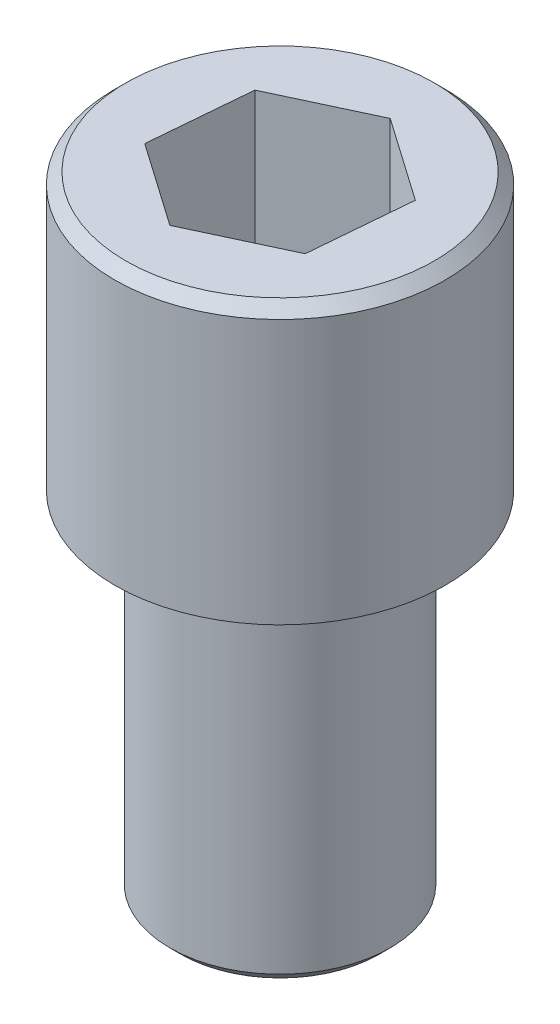
ISO-10303-21;
HEADER;
FILE_DESCRIPTION(('STEP AP214'),'2;1');
FILE_NAME('part.step','',(''),(''),'','','');
FILE_SCHEMA(('AUTOMOTIVE_DESIGN { 1 0 10303 214 1 1 1 1 }'));
ENDSEC;
DATA;
#1=APPLICATION_CONTEXT('core data for automotive mechanical design processes');
#2=APPLICATION_PROTOCOL_DEFINITION('international standard','automotive_design',2000,#1);
#3=PRODUCT_CONTEXT('',#1,'mechanical');
#4=PRODUCT('Part','Part','',(#3));
#5=PRODUCT_RELATED_PRODUCT_CATEGORY('part','',(#4));
#6=PRODUCT_DEFINITION_FORMATION('','',#4);
#7=PRODUCT_DEFINITION_CONTEXT('part definition',#1,'design');
#8=PRODUCT_DEFINITION('design','',#6,#7);
#9=PRODUCT_DEFINITION_SHAPE('','',#8);
#10=(LENGTH_UNIT() NAMED_UNIT(*) SI_UNIT(.MILLI.,.METRE.));
#11=(NAMED_UNIT(*) PLANE_ANGLE_UNIT() SI_UNIT($,.RADIAN.));
#12=(NAMED_UNIT(*) SI_UNIT($,.STERADIAN.) SOLID_ANGLE_UNIT());
#13=UNCERTAINTY_MEASURE_WITH_UNIT(LENGTH_MEASURE(1.E-05),#10,'distance_accuracy_value','');
#14=(GEOMETRIC_REPRESENTATION_CONTEXT(3) GLOBAL_UNCERTAINTY_ASSIGNED_CONTEXT((#13)) GLOBAL_UNIT_ASSIGNED_CONTEXT((#10,
#11,#12)) REPRESENTATION_CONTEXT('',''));
#15=CARTESIAN_POINT('',(0.,0.,0.));
#16=DIRECTION('',(0.,0.,1.));
#17=DIRECTION('',(1.,0.,0.));
#18=AXIS2_PLACEMENT_3D('',#15,#16,#17);
#19=CARTESIAN_POINT('',(0.,8.,0.));
#20=DIRECTION('',(0.,-1.,0.));
#21=DIRECTION('',(0.,0.,-1.));
#22=AXIS2_PLACEMENT_3D('',#19,#20,#21);
#23=CYLINDRICAL_SURFACE('',#22,2.5);
#24=CARTESIAN_POINT('',(0.,0.250000000000004,0.));
#25=DIRECTION('',(0.,1.,0.));
#26=DIRECTION('',(0.,0.,1.));
#27=AXIS2_PLACEMENT_3D('',#24,#25,#26);
#28=CIRCLE('',#27,2.5);
#29=CARTESIAN_POINT('',(0.,0.250000000000004,2.5));
#30=VERTEX_POINT('',#29);
#31=EDGE_CURVE('E146',#30,#30,#28,.T.);
#32=ORIENTED_EDGE('',*,*,#31,.T.);
#33=EDGE_LOOP('',(#32));
#34=FACE_BOUND('',#33,.T.);
#35=CARTESIAN_POINT('',(0.,8.,0.));
#36=DIRECTION('',(0.,1.,0.));
#37=DIRECTION('',(0.,0.,1.));
#38=AXIS2_PLACEMENT_3D('',#35,#36,#37);
#39=CIRCLE('',#38,2.5);
#40=CARTESIAN_POINT('',(0.,8.,2.5));
#41=VERTEX_POINT('',#40);
#42=EDGE_CURVE('E143',#41,#41,#39,.T.);
#43=ORIENTED_EDGE('',*,*,#42,.F.);
#44=EDGE_LOOP('',(#43));
#45=FACE_BOUND('',#44,.T.);
#46=ADVANCED_FACE('F33',(#34,#45),#23,.T.);
#47=CARTESIAN_POINT('',(0.,0.,0.));
#48=DIRECTION('',(0.,1.,0.));
#49=DIRECTION('',(0.,0.,1.));
#50=AXIS2_PLACEMENT_3D('',#47,#48,#49);
#51=PLANE('',#50);
#52=CARTESIAN_POINT('',(0.,0.,0.));
#53=DIRECTION('',(0.,1.,0.));
#54=DIRECTION('',(0.,0.,1.));
#55=AXIS2_PLACEMENT_3D('',#52,#53,#54);
#56=CIRCLE('',#55,2.25);
#57=CARTESIAN_POINT('',(0.,0.,2.25));
#58=VERTEX_POINT('',#57);
#59=EDGE_CURVE('E149',#58,#58,#56,.F.);
#60=ORIENTED_EDGE('',*,*,#59,.T.);
#61=EDGE_LOOP('',(#60));
#62=FACE_BOUND('',#61,.T.);
#63=ADVANCED_FACE('F166',(#62),#51,.F.);
#64=CARTESIAN_POINT('',(0.,14.25,0.));
#65=DIRECTION('',(0.,-1.,0.));
#66=DIRECTION('',(0.,0.,-1.));
#67=AXIS2_PLACEMENT_3D('',#64,#65,#66);
#68=CYLINDRICAL_SURFACE('',#67,3.75);
#69=CARTESIAN_POINT('',(0.,14.,0.));
#70=DIRECTION('',(0.,1.,0.));
#71=DIRECTION('',(0.,0.,1.));
#72=AXIS2_PLACEMENT_3D('',#69,#70,#71);
#73=CIRCLE('',#72,3.75);
#74=CARTESIAN_POINT('',(0.,14.,3.75));
#75=VERTEX_POINT('',#74);
#76=EDGE_CURVE('E11',#75,#75,#73,.F.);
#77=ORIENTED_EDGE('',*,*,#76,.T.);
#78=EDGE_LOOP('',(#77));
#79=FACE_BOUND('',#78,.T.);
#80=CARTESIAN_POINT('',(0.,8.,0.));
#81=DIRECTION('',(0.,1.,0.));
#82=DIRECTION('',(0.,0.,1.));
#83=AXIS2_PLACEMENT_3D('',#80,#81,#82);
#84=CIRCLE('',#83,3.75);
#85=CARTESIAN_POINT('',(0.,8.,3.75));
#86=VERTEX_POINT('',#85);
#87=EDGE_CURVE('E135',#86,#86,#84,.T.);
#88=ORIENTED_EDGE('',*,*,#87,.T.);
#89=EDGE_LOOP('',(#88));
#90=FACE_BOUND('',#89,.T.);
#91=ADVANCED_FACE('F172',(#79,#90),#68,.T.);
#92=CARTESIAN_POINT('',(0.,14.25,0.));
#93=DIRECTION('',(0.,1.,0.));
#94=DIRECTION('',(0.,0.,1.));
#95=AXIS2_PLACEMENT_3D('',#92,#93,#94);
#96=PLANE('',#95);
#97=CARTESIAN_POINT('',(0.,14.25,0.));
#98=DIRECTION('',(0.,1.,0.));
#99=DIRECTION('',(0.,0.,1.));
#100=AXIS2_PLACEMENT_3D('',#97,#98,#99);
#101=CIRCLE('',#100,3.5);
#102=CARTESIAN_POINT('',(0.,14.25,3.5));
#103=VERTEX_POINT('',#102);
#104=EDGE_CURVE('E41',#103,#103,#101,.T.);
#105=ORIENTED_EDGE('',*,*,#104,.T.);
#106=EDGE_LOOP('',(#105));
#107=FACE_BOUND('',#106,.T.);
#108=DIRECTION('',(0.819694119605471,0.,0.572801492913742));
#109=VECTOR('',#108,1.);
#110=CARTESIAN_POINT('',(-2.09210422704223,14.25,0.977974046959006));
#111=LINE('',#110,#109);
#112=CARTESIAN_POINT('',(-2.09210422704223,14.25,0.977974046959006));
#113=VERTEX_POINT('',#112);
#114=CARTESIAN_POINT('',(-0.199101744612739,14.25,2.30080243146288));
#115=VERTEX_POINT('',#114);
#116=EDGE_CURVE('E48',#113,#115,#111,.T.);
#117=ORIENTED_EDGE('',*,*,#116,.F.);
#118=DIRECTION('',(-0.0862135843862166,0.,0.996276677367929));
#119=VECTOR('',#118,1.);
#120=CARTESIAN_POINT('',(-1.89300248242949,14.25,-1.32282838450387));
#121=LINE('',#120,#119);
#122=CARTESIAN_POINT('',(-1.89300248242949,14.25,-1.32282838450387));
#123=VERTEX_POINT('',#122);
#124=EDGE_CURVE('E131',#123,#113,#121,.T.);
#125=ORIENTED_EDGE('',*,*,#124,.F.);
#126=DIRECTION('',(-0.905907703991688,0.,0.423475184454187));
#127=VECTOR('',#126,1.);
#128=CARTESIAN_POINT('',(0.199101744612738,14.25,-2.30080243146288));
#129=LINE('',#128,#127);
#130=CARTESIAN_POINT('',(0.199101744612738,14.25,-2.30080243146288));
#131=VERTEX_POINT('',#130);
#132=EDGE_CURVE('E129',#131,#123,#129,.T.);
#133=ORIENTED_EDGE('',*,*,#132,.F.);
#134=DIRECTION('',(-0.819694119605471,0.,-0.572801492913742));
#135=VECTOR('',#134,1.);
#136=CARTESIAN_POINT('',(2.09210422704223,14.25,-0.977974046959006));
#137=LINE('',#136,#135);
#138=CARTESIAN_POINT('',(2.09210422704223,14.25,-0.977974046959006));
#139=VERTEX_POINT('',#138);
#140=EDGE_CURVE('E96',#139,#131,#137,.T.);
#141=ORIENTED_EDGE('',*,*,#140,.F.);
#142=DIRECTION('',(0.0862135843862168,0.,-0.996276677367929));
#143=VECTOR('',#142,1.);
#144=CARTESIAN_POINT('',(1.89300248242949,14.25,1.32282838450388));
#145=LINE('',#144,#143);
#146=CARTESIAN_POINT('',(1.89300248242949,14.25,1.32282838450388));
#147=VERTEX_POINT('',#146);
#148=EDGE_CURVE('E125',#147,#139,#145,.T.);
#149=ORIENTED_EDGE('',*,*,#148,.F.);
#150=DIRECTION('',(0.905907703991688,0.,-0.423475184454187));
#151=VECTOR('',#150,1.);
#152=CARTESIAN_POINT('',(-0.19910174461274,14.25,2.30080243146288));
#153=LINE('',#152,#151);
#154=EDGE_CURVE('E122',#115,#147,#153,.T.);
#155=ORIENTED_EDGE('',*,*,#154,.F.);
#156=EDGE_LOOP('',(#117,#125,#133,#141,#149,#155));
#157=FACE_BOUND('',#156,.T.);
#158=ADVANCED_FACE('F154',(#107,#157),#96,.T.);
#159=CARTESIAN_POINT('',(0.,8.,0.));
#160=DIRECTION('',(0.,1.,0.));
#161=DIRECTION('',(0.,0.,1.));
#162=AXIS2_PLACEMENT_3D('',#159,#160,#161);
#163=PLANE('',#162);
#164=ORIENTED_EDGE('',*,*,#42,.T.);
#165=EDGE_LOOP('',(#164));
#166=FACE_BOUND('',#165,.T.);
#167=ORIENTED_EDGE('',*,*,#87,.F.);
#168=EDGE_LOOP('',(#167));
#169=FACE_BOUND('',#168,.T.);
#170=ADVANCED_FACE('F180',(#166,#169),#163,.F.);
#171=CARTESIAN_POINT('',(-2.09210422704223,10.5,0.977974046959006));
#172=DIRECTION('',(-0.572801492913742,0.,0.819694119605471));
#173=DIRECTION('',(0.819694119605471,0.,0.572801492913742));
#174=AXIS2_PLACEMENT_3D('',#171,#172,#173);
#175=PLANE('',#174);
#176=ORIENTED_EDGE('',*,*,#116,.T.);
#177=DIRECTION('',(0.,1.,0.));
#178=VECTOR('',#177,1.);
#179=CARTESIAN_POINT('',(-0.19910174461274,10.5,2.30080243146288));
#180=LINE('',#179,#178);
#181=CARTESIAN_POINT('',(-0.19910174461274,10.5,2.30080243146288));
#182=VERTEX_POINT('',#181);
#183=EDGE_CURVE('E78',#182,#115,#180,.T.);
#184=ORIENTED_EDGE('',*,*,#183,.F.);
#185=DIRECTION('',(0.819694119605471,0.,0.572801492913742));
#186=VECTOR('',#185,1.);
#187=CARTESIAN_POINT('',(-2.09210422704223,10.5,0.977974046959006));
#188=LINE('',#187,#186);
#189=CARTESIAN_POINT('',(-2.09210422704223,10.5,0.977974046959006));
#190=VERTEX_POINT('',#189);
#191=EDGE_CURVE('E133',#190,#182,#188,.T.);
#192=ORIENTED_EDGE('',*,*,#191,.F.);
#193=DIRECTION('',(0.,1.,0.));
#194=VECTOR('',#193,1.);
#195=CARTESIAN_POINT('',(-2.09210422704223,10.5,0.977974046959006));
#196=LINE('',#195,#194);
#197=EDGE_CURVE('E56',#190,#113,#196,.T.);
#198=ORIENTED_EDGE('',*,*,#197,.T.);
#199=EDGE_LOOP('',(#176,#184,#192,#198));
#200=FACE_BOUND('',#199,.T.);
#201=ADVANCED_FACE('F183',(#200),#175,.F.);
#202=CARTESIAN_POINT('',(-1.89300248242949,10.5,-1.32282838450387));
#203=DIRECTION('',(-0.996276677367929,0.,-0.0862135843862166));
#204=DIRECTION('',(-0.0862135843862166,0.,0.996276677367929));
#205=AXIS2_PLACEMENT_3D('',#202,#203,#204);
#206=PLANE('',#205);
#207=ORIENTED_EDGE('',*,*,#124,.T.);
#208=ORIENTED_EDGE('',*,*,#197,.F.);
#209=DIRECTION('',(-0.0862135843862166,0.,0.996276677367929));
#210=VECTOR('',#209,1.);
#211=CARTESIAN_POINT('',(-1.89300248242949,10.5,-1.32282838450387));
#212=LINE('',#211,#210);
#213=CARTESIAN_POINT('',(-1.89300248242949,10.5,-1.32282838450387));
#214=VERTEX_POINT('',#213);
#215=EDGE_CURVE('E108',#214,#190,#212,.T.);
#216=ORIENTED_EDGE('',*,*,#215,.F.);
#217=DIRECTION('',(0.,1.,0.));
#218=VECTOR('',#217,1.);
#219=CARTESIAN_POINT('',(-1.89300248242949,10.5,-1.32282838450387));
#220=LINE('',#219,#218);
#221=EDGE_CURVE('E100',#214,#123,#220,.T.);
#222=ORIENTED_EDGE('',*,*,#221,.T.);
#223=EDGE_LOOP('',(#207,#208,#216,#222));
#224=FACE_BOUND('',#223,.T.);
#225=ADVANCED_FACE('F189',(#224),#206,.F.);
#226=CARTESIAN_POINT('',(0.199101744612738,10.5,-2.30080243146288));
#227=DIRECTION('',(-0.423475184454187,0.,-0.905907703991688));
#228=DIRECTION('',(-0.905907703991688,0.,0.423475184454187));
#229=AXIS2_PLACEMENT_3D('',#226,#227,#228);
#230=PLANE('',#229);
#231=ORIENTED_EDGE('',*,*,#132,.T.);
#232=ORIENTED_EDGE('',*,*,#221,.F.);
#233=DIRECTION('',(-0.905907703991688,0.,0.423475184454187));
#234=VECTOR('',#233,1.);
#235=CARTESIAN_POINT('',(0.199101744612738,10.5,-2.30080243146288));
#236=LINE('',#235,#234);
#237=CARTESIAN_POINT('',(0.199101744612738,10.5,-2.30080243146288));
#238=VERTEX_POINT('',#237);
#239=EDGE_CURVE('E104',#238,#214,#236,.T.);
#240=ORIENTED_EDGE('',*,*,#239,.F.);
#241=DIRECTION('',(0.,1.,0.));
#242=VECTOR('',#241,1.);
#243=CARTESIAN_POINT('',(0.199101744612738,10.5,-2.30080243146288));
#244=LINE('',#243,#242);
#245=EDGE_CURVE('E89',#238,#131,#244,.T.);
#246=ORIENTED_EDGE('',*,*,#245,.T.);
#247=EDGE_LOOP('',(#231,#232,#240,#246));
#248=FACE_BOUND('',#247,.T.);
#249=ADVANCED_FACE('F105',(#248),#230,.F.);
#250=CARTESIAN_POINT('',(2.09210422704223,10.5,-0.977974046959006));
#251=DIRECTION('',(0.572801492913742,0.,-0.819694119605471));
#252=DIRECTION('',(-0.819694119605471,0.,-0.572801492913742));
#253=AXIS2_PLACEMENT_3D('',#250,#251,#252);
#254=PLANE('',#253);
#255=ORIENTED_EDGE('',*,*,#140,.T.);
#256=ORIENTED_EDGE('',*,*,#245,.F.);
#257=DIRECTION('',(-0.819694119605471,0.,-0.572801492913742));
#258=VECTOR('',#257,1.);
#259=CARTESIAN_POINT('',(2.09210422704223,10.5,-0.977974046959006));
#260=LINE('',#259,#258);
#261=CARTESIAN_POINT('',(2.09210422704223,10.5,-0.977974046959006));
#262=VERTEX_POINT('',#261);
#263=EDGE_CURVE('E93',#262,#238,#260,.T.);
#264=ORIENTED_EDGE('',*,*,#263,.F.);
#265=DIRECTION('',(0.,1.,0.));
#266=VECTOR('',#265,1.);
#267=CARTESIAN_POINT('',(2.09210422704223,10.5,-0.977974046959006));
#268=LINE('',#267,#266);
#269=EDGE_CURVE('E101',#262,#139,#268,.T.);
#270=ORIENTED_EDGE('',*,*,#269,.T.);
#271=EDGE_LOOP('',(#255,#256,#264,#270));
#272=FACE_BOUND('',#271,.T.);
#273=ADVANCED_FACE('F91',(#272),#254,.F.);
#274=CARTESIAN_POINT('',(1.89300248242949,10.5,1.32282838450388));
#275=DIRECTION('',(0.996276677367929,0.,0.0862135843862169));
#276=DIRECTION('',(0.0862135843862169,0.,-0.996276677367929));
#277=AXIS2_PLACEMENT_3D('',#274,#275,#276);
#278=PLANE('',#277);
#279=ORIENTED_EDGE('',*,*,#148,.T.);
#280=ORIENTED_EDGE('',*,*,#269,.F.);
#281=DIRECTION('',(0.0862135843862168,0.,-0.996276677367929));
#282=VECTOR('',#281,1.);
#283=CARTESIAN_POINT('',(1.89300248242949,10.5,1.32282838450388));
#284=LINE('',#283,#282);
#285=CARTESIAN_POINT('',(1.89300248242949,10.5,1.32282838450388));
#286=VERTEX_POINT('',#285);
#287=EDGE_CURVE('E114',#286,#262,#284,.T.);
#288=ORIENTED_EDGE('',*,*,#287,.F.);
#289=DIRECTION('',(0.,1.,0.));
#290=VECTOR('',#289,1.);
#291=CARTESIAN_POINT('',(1.89300248242949,10.5,1.32282838450388));
#292=LINE('',#291,#290);
#293=EDGE_CURVE('E138',#286,#147,#292,.T.);
#294=ORIENTED_EDGE('',*,*,#293,.T.);
#295=EDGE_LOOP('',(#279,#280,#288,#294));
#296=FACE_BOUND('',#295,.T.);
#297=ADVANCED_FACE('F193',(#296),#278,.F.);
#298=CARTESIAN_POINT('',(-0.19910174461274,10.5,2.30080243146288));
#299=DIRECTION('',(0.423475184454187,0.,0.905907703991688));
#300=DIRECTION('',(0.905907703991688,0.,-0.423475184454187));
#301=AXIS2_PLACEMENT_3D('',#298,#299,#300);
#302=PLANE('',#301);
#303=ORIENTED_EDGE('',*,*,#154,.T.);
#304=ORIENTED_EDGE('',*,*,#293,.F.);
#305=DIRECTION('',(0.905907703991688,0.,-0.423475184454187));
#306=VECTOR('',#305,1.);
#307=CARTESIAN_POINT('',(-0.19910174461274,10.5,2.30080243146288));
#308=LINE('',#307,#306);
#309=EDGE_CURVE('E116',#182,#286,#308,.T.);
#310=ORIENTED_EDGE('',*,*,#309,.F.);
#311=ORIENTED_EDGE('',*,*,#183,.T.);
#312=EDGE_LOOP('',(#303,#304,#310,#311));
#313=FACE_BOUND('',#312,.T.);
#314=ADVANCED_FACE('F190',(#313),#302,.F.);
#315=CARTESIAN_POINT('',(0.,10.5,0.));
#316=DIRECTION('',(0.,1.,0.));
#317=DIRECTION('',(0.,0.,1.));
#318=AXIS2_PLACEMENT_3D('',#315,#316,#317);
#319=PLANE('',#318);
#320=ORIENTED_EDGE('',*,*,#191,.T.);
#321=ORIENTED_EDGE('',*,*,#309,.T.);
#322=ORIENTED_EDGE('',*,*,#287,.T.);
#323=ORIENTED_EDGE('',*,*,#263,.T.);
#324=ORIENTED_EDGE('',*,*,#239,.T.);
#325=ORIENTED_EDGE('',*,*,#215,.T.);
#326=EDGE_LOOP('',(#320,#321,#322,#323,#324,#325));
#327=FACE_BOUND('',#326,.T.);
#328=ADVANCED_FACE('F111',(#327),#319,.T.);
#329=CARTESIAN_POINT('',(0.,0.250000000000004,0.));
#330=DIRECTION('',(0.,1.,0.));
#331=DIRECTION('',(0.,0.,1.));
#332=AXIS2_PLACEMENT_3D('',#329,#330,#331);
#333=CONICAL_SURFACE('',#332,2.5,0.785398163397447);
#334=ORIENTED_EDGE('',*,*,#59,.F.);
#335=EDGE_LOOP('',(#334));
#336=FACE_BOUND('',#335,.T.);
#337=ORIENTED_EDGE('',*,*,#31,.F.);
#338=EDGE_LOOP('',(#337));
#339=FACE_BOUND('',#338,.T.);
#340=ADVANCED_FACE('F158',(#336,#339),#333,.T.);
#341=CARTESIAN_POINT('',(0.,14.25,0.));
#342=DIRECTION('',(0.,-1.,0.));
#343=DIRECTION('',(0.,0.,-1.));
#344=AXIS2_PLACEMENT_3D('',#341,#342,#343);
#345=CONICAL_SURFACE('',#344,3.5,0.785398163397449);
#346=ORIENTED_EDGE('',*,*,#76,.F.);
#347=EDGE_LOOP('',(#346));
#348=FACE_BOUND('',#347,.T.);
#349=ORIENTED_EDGE('',*,*,#104,.F.);
#350=EDGE_LOOP('',(#349));
#351=FACE_BOUND('',#350,.T.);
#352=ADVANCED_FACE('F35',(#348,#351),#345,.T.);
#353=CLOSED_SHELL('',(#46,#63,#91,#158,#170,#201,#225,#249,#273,#297,#314,#328,#340,#352));
#354=MANIFOLD_SOLID_BREP('B2',#353);
#355=ADVANCED_BREP_SHAPE_REPRESENTATION('',(#18,#354),#14);
#356=SHAPE_DEFINITION_REPRESENTATION(#9,#355);
ENDSEC;
END-ISO-10303-21;
